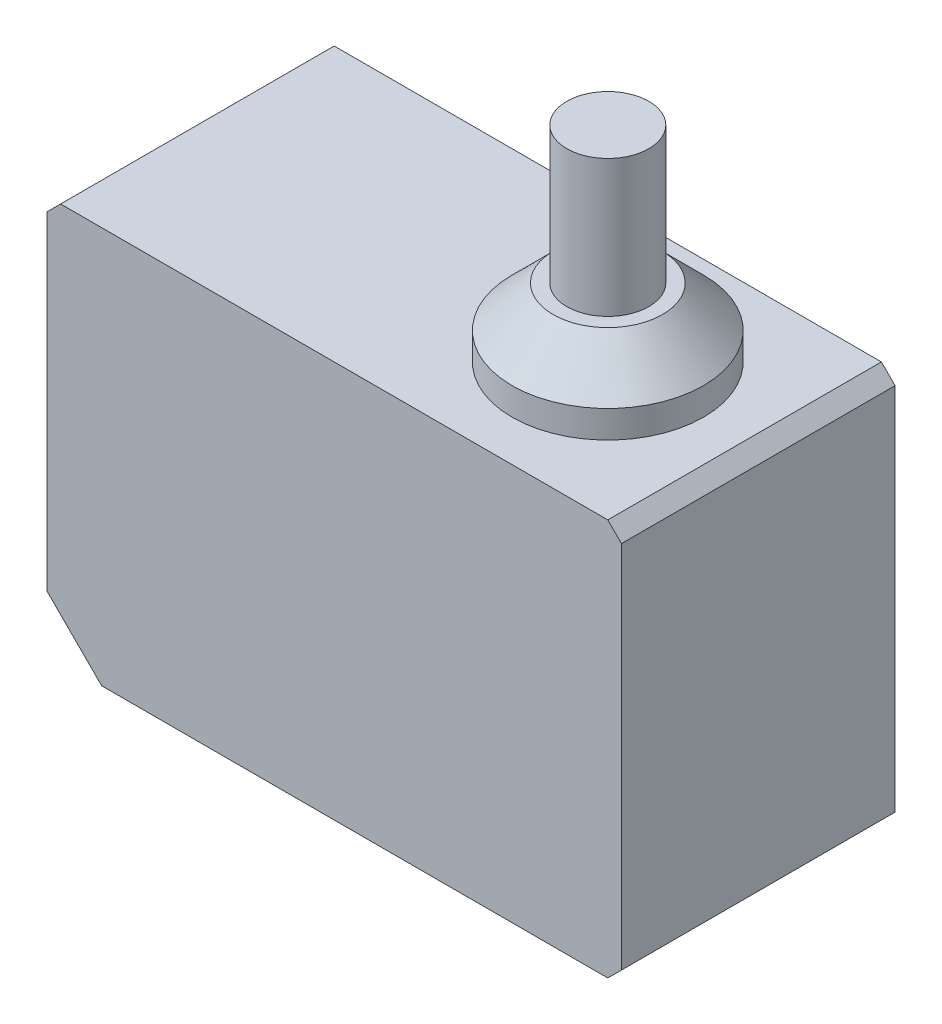
ISO-10303-21;
HEADER;
FILE_DESCRIPTION(('STEP AP214'),'2;1');
FILE_NAME('part.step','',(''),(''),'','','');
FILE_SCHEMA(('AUTOMOTIVE_DESIGN { 1 0 10303 214 1 1 1 1 }'));
ENDSEC;
DATA;
#1=APPLICATION_CONTEXT('core data for automotive mechanical design processes');
#2=APPLICATION_PROTOCOL_DEFINITION('international standard','automotive_design',2000,#1);
#3=PRODUCT_CONTEXT('',#1,'mechanical');
#4=PRODUCT('Part','Part','',(#3));
#5=PRODUCT_RELATED_PRODUCT_CATEGORY('part','',(#4));
#6=PRODUCT_DEFINITION_FORMATION('','',#4);
#7=PRODUCT_DEFINITION_CONTEXT('part definition',#1,'design');
#8=PRODUCT_DEFINITION('design','',#6,#7);
#9=PRODUCT_DEFINITION_SHAPE('','',#8);
#10=(LENGTH_UNIT() NAMED_UNIT(*) SI_UNIT(.MILLI.,.METRE.));
#11=(NAMED_UNIT(*) PLANE_ANGLE_UNIT() SI_UNIT($,.RADIAN.));
#12=(NAMED_UNIT(*) SI_UNIT($,.STERADIAN.) SOLID_ANGLE_UNIT());
#13=UNCERTAINTY_MEASURE_WITH_UNIT(LENGTH_MEASURE(1.E-05),#10,'distance_accuracy_value','');
#14=(GEOMETRIC_REPRESENTATION_CONTEXT(3) GLOBAL_UNCERTAINTY_ASSIGNED_CONTEXT((#13)) GLOBAL_UNIT_ASSIGNED_CONTEXT((#10,
#11,#12)) REPRESENTATION_CONTEXT('',''));
#15=CARTESIAN_POINT('',(0.,0.,0.));
#16=DIRECTION('',(0.,0.,1.));
#17=DIRECTION('',(1.,0.,0.));
#18=AXIS2_PLACEMENT_3D('',#15,#16,#17);
#19=CARTESIAN_POINT('',(31.,34.,10.));
#20=DIRECTION('',(0.,1.,0.));
#21=DIRECTION('',(0.,0.,1.));
#22=AXIS2_PLACEMENT_3D('',#19,#20,#21);
#23=PLANE('',#22);
#24=CARTESIAN_POINT('',(31.,34.,10.));
#25=DIRECTION('',(0.,1.,0.));
#26=DIRECTION('',(0.,0.,1.));
#27=AXIS2_PLACEMENT_3D('',#24,#25,#26);
#28=CIRCLE('',#27,4.);
#29=CARTESIAN_POINT('',(31.,34.,6.));
#30=VERTEX_POINT('',#29);
#31=EDGE_CURVE('E45',#30,#30,#28,.T.);
#32=ORIENTED_EDGE('',*,*,#31,.T.);
#33=EDGE_LOOP('',(#32));
#34=FACE_BOUND('',#33,.T.);
#35=CARTESIAN_POINT('',(31.,34.,10.));
#36=DIRECTION('',(0.,1.,0.));
#37=DIRECTION('',(0.,0.,1.));
#38=AXIS2_PLACEMENT_3D('',#35,#36,#37);
#39=CIRCLE('',#38,3.);
#40=CARTESIAN_POINT('',(31.,34.,13.));
#41=VERTEX_POINT('',#40);
#42=EDGE_CURVE('E234',#41,#41,#39,.T.);
#43=ORIENTED_EDGE('',*,*,#42,.F.);
#44=EDGE_LOOP('',(#43));
#45=FACE_BOUND('',#44,.T.);
#46=ADVANCED_FACE('F37',(#34,#45),#23,.T.);
#47=CARTESIAN_POINT('',(0.,29.,20.));
#48=DIRECTION('',(0.,-1.,0.));
#49=DIRECTION('',(0.,0.,-1.));
#50=AXIS2_PLACEMENT_3D('',#47,#48,#49);
#51=PLANE('',#50);
#52=DIRECTION('',(-1.,0.,0.));
#53=VECTOR('',#52,1.);
#54=CARTESIAN_POINT('',(0.,29.,20.));
#55=LINE('',#54,#53);
#56=CARTESIAN_POINT('',(41.,29.,20.));
#57=VERTEX_POINT('',#56);
#58=CARTESIAN_POINT('',(1.,29.,20.));
#59=VERTEX_POINT('',#58);
#60=EDGE_CURVE('E117',#57,#59,#55,.T.);
#61=ORIENTED_EDGE('',*,*,#60,.F.);
#62=DIRECTION('',(0.,0.,-1.));
#63=VECTOR('',#62,1.);
#64=CARTESIAN_POINT('',(41.,29.,20.));
#65=LINE('',#64,#63);
#66=CARTESIAN_POINT('',(41.,29.,0.));
#67=VERTEX_POINT('',#66);
#68=EDGE_CURVE('E137',#57,#67,#65,.T.);
#69=ORIENTED_EDGE('',*,*,#68,.T.);
#70=DIRECTION('',(-1.,0.,0.));
#71=VECTOR('',#70,1.);
#72=CARTESIAN_POINT('',(0.,29.,0.));
#73=LINE('',#72,#71);
#74=CARTESIAN_POINT('',(1.,29.,0.));
#75=VERTEX_POINT('',#74);
#76=EDGE_CURVE('E123',#67,#75,#73,.T.);
#77=ORIENTED_EDGE('',*,*,#76,.T.);
#78=DIRECTION('',(0.,0.,1.));
#79=VECTOR('',#78,1.);
#80=CARTESIAN_POINT('',(1.,29.,20.));
#81=LINE('',#80,#79);
#82=EDGE_CURVE('E135',#75,#59,#81,.T.);
#83=ORIENTED_EDGE('',*,*,#82,.T.);
#84=EDGE_LOOP('',(#61,#69,#77,#83));
#85=FACE_BOUND('',#84,.T.);
#86=CARTESIAN_POINT('',(31.,29.,10.));
#87=DIRECTION('',(0.,-1.,0.));
#88=DIRECTION('',(0.,0.,-1.));
#89=AXIS2_PLACEMENT_3D('',#86,#87,#88);
#90=CIRCLE('',#89,7.);
#91=CARTESIAN_POINT('',(31.,29.,3.));
#92=VERTEX_POINT('',#91);
#93=EDGE_CURVE('E162',#92,#92,#90,.F.);
#94=ORIENTED_EDGE('',*,*,#93,.F.);
#95=EDGE_LOOP('',(#94));
#96=FACE_BOUND('',#95,.T.);
#97=ADVANCED_FACE('F185',(#85,#96),#51,.F.);
#98=CARTESIAN_POINT('',(0.,0.,20.));
#99=DIRECTION('',(1.,0.,0.));
#100=DIRECTION('',(0.,0.,-1.));
#101=AXIS2_PLACEMENT_3D('',#98,#99,#100);
#102=PLANE('',#101);
#103=DIRECTION('',(0.,-1.,0.));
#104=VECTOR('',#103,1.);
#105=CARTESIAN_POINT('',(0.,0.,20.));
#106=LINE('',#105,#104);
#107=CARTESIAN_POINT('',(0.,28.,20.));
#108=VERTEX_POINT('',#107);
#109=CARTESIAN_POINT('',(0.,4.00000000000002,20.));
#110=VERTEX_POINT('',#109);
#111=EDGE_CURVE('E130',#108,#110,#106,.T.);
#112=ORIENTED_EDGE('',*,*,#111,.F.);
#113=DIRECTION('',(0.,0.,-1.));
#114=VECTOR('',#113,1.);
#115=CARTESIAN_POINT('',(0.,28.,20.));
#116=LINE('',#115,#114);
#117=CARTESIAN_POINT('',(0.,28.,0.));
#118=VERTEX_POINT('',#117);
#119=EDGE_CURVE('E152',#108,#118,#116,.T.);
#120=ORIENTED_EDGE('',*,*,#119,.T.);
#121=DIRECTION('',(0.,-1.,0.));
#122=VECTOR('',#121,1.);
#123=CARTESIAN_POINT('',(0.,0.,0.));
#124=LINE('',#123,#122);
#125=CARTESIAN_POINT('',(0.,4.00000000000002,0.));
#126=VERTEX_POINT('',#125);
#127=EDGE_CURVE('E121',#118,#126,#124,.T.);
#128=ORIENTED_EDGE('',*,*,#127,.T.);
#129=DIRECTION('',(0.,0.,1.));
#130=VECTOR('',#129,1.);
#131=CARTESIAN_POINT('',(0.,4.00000000000002,20.));
#132=LINE('',#131,#130);
#133=EDGE_CURVE('E111',#126,#110,#132,.T.);
#134=ORIENTED_EDGE('',*,*,#133,.T.);
#135=EDGE_LOOP('',(#112,#120,#128,#134));
#136=FACE_BOUND('',#135,.T.);
#137=ADVANCED_FACE('F190',(#136),#102,.F.);
#138=CARTESIAN_POINT('',(0.,0.,20.));
#139=DIRECTION('',(0.,1.,0.));
#140=DIRECTION('',(0.,0.,1.));
#141=AXIS2_PLACEMENT_3D('',#138,#139,#140);
#142=PLANE('',#141);
#143=DIRECTION('',(1.,0.,0.));
#144=VECTOR('',#143,1.);
#145=CARTESIAN_POINT('',(0.,0.,0.));
#146=LINE('',#145,#144);
#147=CARTESIAN_POINT('',(4.00000000000001,0.,0.));
#148=VERTEX_POINT('',#147);
#149=CARTESIAN_POINT('',(41.,0.,0.));
#150=VERTEX_POINT('',#149);
#151=EDGE_CURVE('E115',#148,#150,#146,.T.);
#152=ORIENTED_EDGE('',*,*,#151,.T.);
#153=DIRECTION('',(0.,0.,1.));
#154=VECTOR('',#153,1.);
#155=CARTESIAN_POINT('',(41.,0.,20.));
#156=LINE('',#155,#154);
#157=CARTESIAN_POINT('',(41.,0.,20.));
#158=VERTEX_POINT('',#157);
#159=EDGE_CURVE('E52',#150,#158,#156,.T.);
#160=ORIENTED_EDGE('',*,*,#159,.T.);
#161=DIRECTION('',(1.,0.,0.));
#162=VECTOR('',#161,1.);
#163=CARTESIAN_POINT('',(0.,0.,20.));
#164=LINE('',#163,#162);
#165=CARTESIAN_POINT('',(4.00000000000001,0.,20.));
#166=VERTEX_POINT('',#165);
#167=EDGE_CURVE('E116',#166,#158,#164,.T.);
#168=ORIENTED_EDGE('',*,*,#167,.F.);
#169=DIRECTION('',(0.,0.,-1.));
#170=VECTOR('',#169,1.);
#171=CARTESIAN_POINT('',(4.00000000000001,0.,20.));
#172=LINE('',#171,#170);
#173=EDGE_CURVE('E109',#166,#148,#172,.T.);
#174=ORIENTED_EDGE('',*,*,#173,.T.);
#175=EDGE_LOOP('',(#152,#160,#168,#174));
#176=FACE_BOUND('',#175,.T.);
#177=ADVANCED_FACE('F114',(#176),#142,.F.);
#178=CARTESIAN_POINT('',(42.,0.,20.));
#179=DIRECTION('',(-1.,0.,0.));
#180=DIRECTION('',(0.,0.,1.));
#181=AXIS2_PLACEMENT_3D('',#178,#179,#180);
#182=PLANE('',#181);
#183=DIRECTION('',(0.,1.,0.));
#184=VECTOR('',#183,1.);
#185=CARTESIAN_POINT('',(42.,0.,20.));
#186=LINE('',#185,#184);
#187=CARTESIAN_POINT('',(42.,1.00000000000001,20.));
#188=VERTEX_POINT('',#187);
#189=CARTESIAN_POINT('',(42.,28.,20.));
#190=VERTEX_POINT('',#189);
#191=EDGE_CURVE('E226',#188,#190,#186,.T.);
#192=ORIENTED_EDGE('',*,*,#191,.F.);
#193=DIRECTION('',(0.,0.,-1.));
#194=VECTOR('',#193,1.);
#195=CARTESIAN_POINT('',(42.,1.00000000000001,20.));
#196=LINE('',#195,#194);
#197=CARTESIAN_POINT('',(42.,1.00000000000001,0.));
#198=VERTEX_POINT('',#197);
#199=EDGE_CURVE('E155',#188,#198,#196,.T.);
#200=ORIENTED_EDGE('',*,*,#199,.T.);
#201=DIRECTION('',(0.,1.,0.));
#202=VECTOR('',#201,1.);
#203=CARTESIAN_POINT('',(42.,0.,0.));
#204=LINE('',#203,#202);
#205=CARTESIAN_POINT('',(42.,28.,0.));
#206=VERTEX_POINT('',#205);
#207=EDGE_CURVE('E120',#198,#206,#204,.T.);
#208=ORIENTED_EDGE('',*,*,#207,.T.);
#209=DIRECTION('',(0.,0.,1.));
#210=VECTOR('',#209,1.);
#211=CARTESIAN_POINT('',(42.,28.,20.));
#212=LINE('',#211,#210);
#213=EDGE_CURVE('E145',#206,#190,#212,.T.);
#214=ORIENTED_EDGE('',*,*,#213,.T.);
#215=EDGE_LOOP('',(#192,#200,#208,#214));
#216=FACE_BOUND('',#215,.T.);
#217=ADVANCED_FACE('F198',(#216),#182,.F.);
#218=CARTESIAN_POINT('',(0.,0.,20.));
#219=DIRECTION('',(0.,0.,-1.));
#220=DIRECTION('',(-1.,0.,0.));
#221=AXIS2_PLACEMENT_3D('',#218,#219,#220);
#222=PLANE('',#221);
#223=ORIENTED_EDGE('',*,*,#167,.T.);
#224=DIRECTION('',(-0.707106781186548,-0.707106781186548,0.));
#225=VECTOR('',#224,1.);
#226=CARTESIAN_POINT('',(42.,1.00000000000001,20.));
#227=LINE('',#226,#225);
#228=EDGE_CURVE('E160',#158,#188,#227,.F.);
#229=ORIENTED_EDGE('',*,*,#228,.T.);
#230=ORIENTED_EDGE('',*,*,#191,.T.);
#231=DIRECTION('',(0.707106781186545,-0.70710678118655,0.));
#232=VECTOR('',#231,1.);
#233=CARTESIAN_POINT('',(41.,29.,20.));
#234=LINE('',#233,#232);
#235=EDGE_CURVE('E150',#190,#57,#234,.F.);
#236=ORIENTED_EDGE('',*,*,#235,.T.);
#237=ORIENTED_EDGE('',*,*,#60,.T.);
#238=DIRECTION('',(0.707106781186548,0.707106781186548,0.));
#239=VECTOR('',#238,1.);
#240=CARTESIAN_POINT('',(0.,28.,20.));
#241=LINE('',#240,#239);
#242=EDGE_CURVE('E148',#59,#108,#241,.F.);
#243=ORIENTED_EDGE('',*,*,#242,.T.);
#244=ORIENTED_EDGE('',*,*,#111,.T.);
#245=DIRECTION('',(-0.707106781186546,0.707106781186549,0.));
#246=VECTOR('',#245,1.);
#247=CARTESIAN_POINT('',(4.00000000000001,0.,20.));
#248=LINE('',#247,#246);
#249=EDGE_CURVE('E133',#110,#166,#248,.F.);
#250=ORIENTED_EDGE('',*,*,#249,.T.);
#251=EDGE_LOOP('',(#223,#229,#230,#236,#237,#243,#244,#250));
#252=FACE_BOUND('',#251,.T.);
#253=ADVANCED_FACE('F195',(#252),#222,.F.);
#254=CARTESIAN_POINT('',(0.,0.,0.));
#255=DIRECTION('',(0.,0.,-1.));
#256=DIRECTION('',(-1.,0.,0.));
#257=AXIS2_PLACEMENT_3D('',#254,#255,#256);
#258=PLANE('',#257);
#259=ORIENTED_EDGE('',*,*,#207,.F.);
#260=DIRECTION('',(0.707106781186548,0.707106781186548,0.));
#261=VECTOR('',#260,1.);
#262=CARTESIAN_POINT('',(20.5,-20.5,0.));
#263=LINE('',#262,#261);
#264=EDGE_CURVE('E60',#198,#150,#263,.F.);
#265=ORIENTED_EDGE('',*,*,#264,.T.);
#266=ORIENTED_EDGE('',*,*,#151,.F.);
#267=DIRECTION('',(0.707106781186546,-0.707106781186549,0.));
#268=VECTOR('',#267,1.);
#269=CARTESIAN_POINT('',(2.00000000000001,2.00000000000001,0.));
#270=LINE('',#269,#268);
#271=EDGE_CURVE('E105',#148,#126,#270,.F.);
#272=ORIENTED_EDGE('',*,*,#271,.T.);
#273=ORIENTED_EDGE('',*,*,#127,.F.);
#274=DIRECTION('',(-0.707106781186548,-0.707106781186548,0.));
#275=VECTOR('',#274,1.);
#276=CARTESIAN_POINT('',(-14.,14.,0.));
#277=LINE('',#276,#275);
#278=EDGE_CURVE('E140',#118,#75,#277,.F.);
#279=ORIENTED_EDGE('',*,*,#278,.T.);
#280=ORIENTED_EDGE('',*,*,#76,.F.);
#281=DIRECTION('',(-0.707106781186545,0.70710678118655,0.));
#282=VECTOR('',#281,1.);
#283=CARTESIAN_POINT('',(35.0000000000001,34.9999999999999,0.));
#284=LINE('',#283,#282);
#285=EDGE_CURVE('E142',#67,#206,#284,.F.);
#286=ORIENTED_EDGE('',*,*,#285,.T.);
#287=EDGE_LOOP('',(#259,#265,#266,#272,#273,#279,#280,#286));
#288=FACE_BOUND('',#287,.T.);
#289=ADVANCED_FACE('F119',(#288),#258,.T.);
#290=CARTESIAN_POINT('',(4.00000000000001,0.,20.));
#291=DIRECTION('',(0.707106781186549,0.707106781186546,0.));
#292=DIRECTION('',(0.,0.,-1.));
#293=AXIS2_PLACEMENT_3D('',#290,#291,#292);
#294=PLANE('',#293);
#295=ORIENTED_EDGE('',*,*,#249,.F.);
#296=ORIENTED_EDGE('',*,*,#133,.F.);
#297=ORIENTED_EDGE('',*,*,#271,.F.);
#298=ORIENTED_EDGE('',*,*,#173,.F.);
#299=EDGE_LOOP('',(#295,#296,#297,#298));
#300=FACE_BOUND('',#299,.T.);
#301=ADVANCED_FACE('F108',(#300),#294,.F.);
#302=CARTESIAN_POINT('',(41.,29.,20.));
#303=DIRECTION('',(-0.70710678118655,-0.707106781186545,0.));
#304=DIRECTION('',(0.,0.,-1.));
#305=AXIS2_PLACEMENT_3D('',#302,#303,#304);
#306=PLANE('',#305);
#307=ORIENTED_EDGE('',*,*,#235,.F.);
#308=ORIENTED_EDGE('',*,*,#213,.F.);
#309=ORIENTED_EDGE('',*,*,#285,.F.);
#310=ORIENTED_EDGE('',*,*,#68,.F.);
#311=EDGE_LOOP('',(#307,#308,#309,#310));
#312=FACE_BOUND('',#311,.T.);
#313=ADVANCED_FACE('F212',(#312),#306,.F.);
#314=CARTESIAN_POINT('',(0.,28.,20.));
#315=DIRECTION('',(0.707106781186547,-0.707106781186547,0.));
#316=DIRECTION('',(0.,0.,-1.));
#317=AXIS2_PLACEMENT_3D('',#314,#315,#316);
#318=PLANE('',#317);
#319=ORIENTED_EDGE('',*,*,#242,.F.);
#320=ORIENTED_EDGE('',*,*,#82,.F.);
#321=ORIENTED_EDGE('',*,*,#278,.F.);
#322=ORIENTED_EDGE('',*,*,#119,.F.);
#323=EDGE_LOOP('',(#319,#320,#321,#322));
#324=FACE_BOUND('',#323,.T.);
#325=ADVANCED_FACE('F215',(#324),#318,.F.);
#326=CARTESIAN_POINT('',(42.,1.00000000000001,20.));
#327=DIRECTION('',(-0.707106781186547,0.707106781186547,0.));
#328=DIRECTION('',(0.,0.,-1.));
#329=AXIS2_PLACEMENT_3D('',#326,#327,#328);
#330=PLANE('',#329);
#331=ORIENTED_EDGE('',*,*,#228,.F.);
#332=ORIENTED_EDGE('',*,*,#159,.F.);
#333=ORIENTED_EDGE('',*,*,#264,.F.);
#334=ORIENTED_EDGE('',*,*,#199,.F.);
#335=EDGE_LOOP('',(#331,#332,#333,#334));
#336=FACE_BOUND('',#335,.T.);
#337=ADVANCED_FACE('F180',(#336),#330,.F.);
#338=CARTESIAN_POINT('',(31.,34.,10.));
#339=DIRECTION('',(0.,-1.,0.));
#340=DIRECTION('',(0.,0.,-1.));
#341=AXIS2_PLACEMENT_3D('',#338,#339,#340);
#342=CYLINDRICAL_SURFACE('',#341,7.);
#343=CARTESIAN_POINT('',(31.,31.,10.));
#344=DIRECTION('',(0.,1.,0.));
#345=DIRECTION('',(0.,0.,1.));
#346=AXIS2_PLACEMENT_3D('',#343,#344,#345);
#347=CIRCLE('',#346,7.);
#348=CARTESIAN_POINT('',(31.,31.,3.));
#349=VERTEX_POINT('',#348);
#350=EDGE_CURVE('E11',#349,#349,#347,.F.);
#351=ORIENTED_EDGE('',*,*,#350,.T.);
#352=EDGE_LOOP('',(#351));
#353=FACE_BOUND('',#352,.T.);
#354=ORIENTED_EDGE('',*,*,#93,.T.);
#355=EDGE_LOOP('',(#354));
#356=FACE_BOUND('',#355,.T.);
#357=ADVANCED_FACE('F171',(#353,#356),#342,.T.);
#358=CARTESIAN_POINT('',(31.,34.,10.));
#359=DIRECTION('',(0.,-1.,0.));
#360=DIRECTION('',(0.,0.,-1.));
#361=AXIS2_PLACEMENT_3D('',#358,#359,#360);
#362=CONICAL_SURFACE('',#361,4.,0.785398163397448);
#363=CARTESIAN_POINT('',(31.,31.,3.));
#364=CARTESIAN_POINT('',(31.,31.03125,3.03125));
#365=CARTESIAN_POINT('',(31.,31.0625,3.0625));
#366=CARTESIAN_POINT('',(31.,31.125,3.125));
#367=CARTESIAN_POINT('',(31.,31.15625,3.15625));
#368=CARTESIAN_POINT('',(31.,31.21875,3.21875));
#369=CARTESIAN_POINT('',(31.,31.25,3.25));
#370=CARTESIAN_POINT('',(31.,31.3125,3.3125));
#371=CARTESIAN_POINT('',(31.,31.34375,3.34375));
#372=CARTESIAN_POINT('',(31.,31.40625,3.40625));
#373=CARTESIAN_POINT('',(31.,31.4375,3.4375));
#374=CARTESIAN_POINT('',(31.,31.5,3.5));
#375=CARTESIAN_POINT('',(31.,31.53125,3.53125));
#376=CARTESIAN_POINT('',(31.,31.59375,3.59375));
#377=CARTESIAN_POINT('',(31.,31.625,3.625));
#378=CARTESIAN_POINT('',(31.,31.6875,3.6875));
#379=CARTESIAN_POINT('',(31.,31.71875,3.71875));
#380=CARTESIAN_POINT('',(31.,31.78125,3.78125));
#381=CARTESIAN_POINT('',(31.,31.8125,3.8125));
#382=CARTESIAN_POINT('',(31.,31.875,3.875));
#383=CARTESIAN_POINT('',(31.,31.90625,3.90625));
#384=CARTESIAN_POINT('',(31.,31.96875,3.96875));
#385=CARTESIAN_POINT('',(31.,32.,4.));
#386=CARTESIAN_POINT('',(31.,32.0625,4.0625));
#387=CARTESIAN_POINT('',(31.,32.09375,4.09375));
#388=CARTESIAN_POINT('',(31.,32.15625,4.15625));
#389=CARTESIAN_POINT('',(31.,32.1875,4.1875));
#390=CARTESIAN_POINT('',(31.,32.25,4.25));
#391=CARTESIAN_POINT('',(31.,32.28125,4.28125));
#392=CARTESIAN_POINT('',(31.,32.34375,4.34375));
#393=CARTESIAN_POINT('',(31.,32.375,4.375));
#394=CARTESIAN_POINT('',(31.,32.4375,4.4375));
#395=CARTESIAN_POINT('',(31.,32.46875,4.46875));
#396=CARTESIAN_POINT('',(31.,32.53125,4.53125));
#397=CARTESIAN_POINT('',(31.,32.5625,4.5625));
#398=CARTESIAN_POINT('',(31.,32.625,4.625));
#399=CARTESIAN_POINT('',(31.,32.65625,4.65625));
#400=CARTESIAN_POINT('',(31.,32.71875,4.71875));
#401=CARTESIAN_POINT('',(31.,32.75,4.75));
#402=CARTESIAN_POINT('',(31.,32.8125,4.8125));
#403=CARTESIAN_POINT('',(31.,32.84375,4.84375));
#404=CARTESIAN_POINT('',(31.,32.90625,4.90625));
#405=CARTESIAN_POINT('',(31.,32.9375,4.9375));
#406=CARTESIAN_POINT('',(31.,33.,5.));
#407=CARTESIAN_POINT('',(31.,33.03125,5.03125));
#408=CARTESIAN_POINT('',(31.,33.09375,5.09375));
#409=CARTESIAN_POINT('',(31.,33.125,5.125));
#410=CARTESIAN_POINT('',(31.,33.1875,5.1875));
#411=CARTESIAN_POINT('',(31.,33.21875,5.21875));
#412=CARTESIAN_POINT('',(31.,33.28125,5.28125));
#413=CARTESIAN_POINT('',(31.,33.3125,5.3125));
#414=CARTESIAN_POINT('',(31.,33.375,5.375));
#415=CARTESIAN_POINT('',(31.,33.40625,5.40625));
#416=CARTESIAN_POINT('',(31.,33.46875,5.46875));
#417=CARTESIAN_POINT('',(31.,33.5,5.5));
#418=CARTESIAN_POINT('',(31.,33.5625,5.5625));
#419=CARTESIAN_POINT('',(31.,33.59375,5.59375));
#420=CARTESIAN_POINT('',(31.,33.65625,5.65625));
#421=CARTESIAN_POINT('',(31.,33.6875,5.6875));
#422=CARTESIAN_POINT('',(31.,33.75,5.75));
#423=CARTESIAN_POINT('',(31.,33.78125,5.78125));
#424=CARTESIAN_POINT('',(31.,33.84375,5.84375));
#425=CARTESIAN_POINT('',(31.,33.875,5.875));
#426=CARTESIAN_POINT('',(31.,33.9375,5.9375));
#427=CARTESIAN_POINT('',(31.,33.96875,5.96875));
#428=CARTESIAN_POINT('',(31.,34.,6.));
#429=B_SPLINE_CURVE_WITH_KNOTS('',3,(#363,#364,#365,#366,#367,#368,#369,#370,#371,#372,#373,
#374,#375,#376,#377,#378,#379,#380,#381,#382,#383,#384,#385,#386,#387,#388,#389,#390,#391,#392,
#393,#394,#395,#396,#397,#398,#399,#400,#401,#402,#403,#404,#405,#406,#407,#408,#409,#410,#411,
#412,#413,#414,#415,#416,#417,#418,#419,#420,#421,#422,#423,#424,#425,#426,#427,#428),
.UNSPECIFIED.,.F.,.F.,(4,2,2,2,2,2,2,2,2,2,2,2,2,2,2,2,2,2,2,2,2,2,2,2,2,2,2,2,2,2,2,2,4),(0.,
0.132582521472478,0.265165042944956,0.397747564417433,0.530330085889908,0.662912607362389,
0.795495128834864,0.928077650307345,1.06066017177982,1.1932426932523,1.32582521472477,
1.45840773619726,1.59099025766973,1.72357277914221,1.85615530061469,1.98873782208717,
2.12132034355964,2.25390286503212,2.3864853865046,2.51906790797708,2.65165042944955,
2.78423295092203,2.91681547239451,3.04939799386699,3.18198051533946,3.31456303681194,
3.44714555828442,3.5797280797569,3.71231060122938,3.84489312270186,3.97747564417434,
4.11005816564681,4.24264068711929),.UNSPECIFIED.);
#430=EDGE_CURVE('BSEAM39',#349,#30,#429,.T.);
#431=ORIENTED_EDGE('',*,*,#350,.F.);
#432=ORIENTED_EDGE('',*,*,#31,.F.);
#433=ORIENTED_EDGE('',*,*,#430,.T.);
#434=ORIENTED_EDGE('',*,*,#430,.F.);
#435=EDGE_LOOP('',(#431,#433,#432,#434));
#436=FACE_BOUND('',#435,.T.);
#437=ADVANCED_FACE('F39',(#436),#362,.T.);
#438=CARTESIAN_POINT('',(31.,44.,10.));
#439=DIRECTION('',(0.,-1.,0.));
#440=DIRECTION('',(0.,0.,-1.));
#441=AXIS2_PLACEMENT_3D('',#438,#439,#440);
#442=CYLINDRICAL_SURFACE('',#441,3.);
#443=CARTESIAN_POINT('',(31.,44.,10.));
#444=DIRECTION('',(0.,1.,0.));
#445=DIRECTION('',(0.,0.,1.));
#446=AXIS2_PLACEMENT_3D('',#443,#444,#445);
#447=CIRCLE('',#446,3.);
#448=CARTESIAN_POINT('',(31.,44.,13.));
#449=VERTEX_POINT('',#448);
#450=EDGE_CURVE('E125',#449,#449,#447,.T.);
#451=ORIENTED_EDGE('',*,*,#450,.F.);
#452=EDGE_LOOP('',(#451));
#453=FACE_BOUND('',#452,.T.);
#454=ORIENTED_EDGE('',*,*,#42,.T.);
#455=EDGE_LOOP('',(#454));
#456=FACE_BOUND('',#455,.T.);
#457=ADVANCED_FACE('F170',(#453,#456),#442,.T.);
#458=CARTESIAN_POINT('',(31.,44.,10.));
#459=DIRECTION('',(0.,1.,0.));
#460=DIRECTION('',(0.,0.,1.));
#461=AXIS2_PLACEMENT_3D('',#458,#459,#460);
#462=PLANE('',#461);
#463=ORIENTED_EDGE('',*,*,#450,.T.);
#464=EDGE_LOOP('',(#463));
#465=FACE_BOUND('',#464,.T.);
#466=ADVANCED_FACE('F177',(#465),#462,.T.);
#467=CLOSED_SHELL('',(#46,#97,#137,#177,#217,#253,#289,#301,#313,#325,#337,#357,#437,#457,#466));
#468=MANIFOLD_SOLID_BREP('B2',#467);
#469=ADVANCED_BREP_SHAPE_REPRESENTATION('',(#18,#468),#14);
#470=SHAPE_DEFINITION_REPRESENTATION(#9,#469);
ENDSEC;
END-ISO-10303-21;
